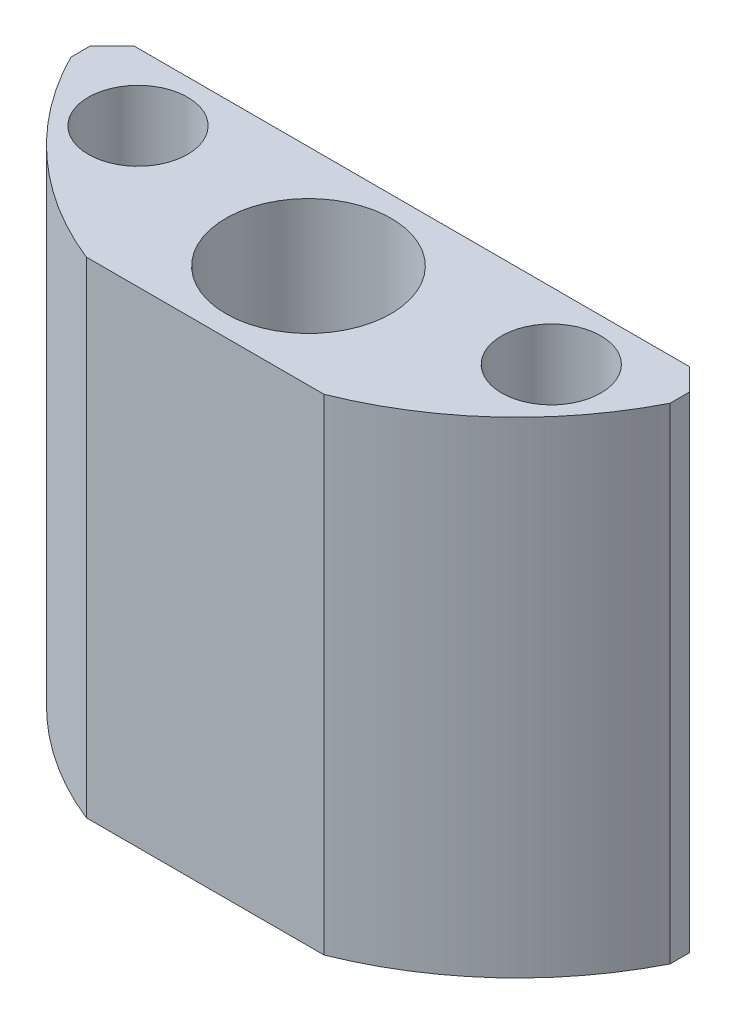
ISO-10303-21;
HEADER;
FILE_DESCRIPTION(('STEP AP214'),'2;1');
FILE_NAME('part.step','',(''),(''),'','','');
FILE_SCHEMA(('AUTOMOTIVE_DESIGN { 1 0 10303 214 1 1 1 1 }'));
ENDSEC;
DATA;
#1=APPLICATION_CONTEXT('core data for automotive mechanical design processes');
#2=APPLICATION_PROTOCOL_DEFINITION('international standard','automotive_design',2000,#1);
#3=PRODUCT_CONTEXT('',#1,'mechanical');
#4=PRODUCT('Part','Part','',(#3));
#5=PRODUCT_RELATED_PRODUCT_CATEGORY('part','',(#4));
#6=PRODUCT_DEFINITION_FORMATION('','',#4);
#7=PRODUCT_DEFINITION_CONTEXT('part definition',#1,'design');
#8=PRODUCT_DEFINITION('design','',#6,#7);
#9=PRODUCT_DEFINITION_SHAPE('','',#8);
#10=(LENGTH_UNIT() NAMED_UNIT(*) SI_UNIT(.MILLI.,.METRE.));
#11=(NAMED_UNIT(*) PLANE_ANGLE_UNIT() SI_UNIT($,.RADIAN.));
#12=(NAMED_UNIT(*) SI_UNIT($,.STERADIAN.) SOLID_ANGLE_UNIT());
#13=UNCERTAINTY_MEASURE_WITH_UNIT(LENGTH_MEASURE(1.E-05),#10,'distance_accuracy_value','');
#14=(GEOMETRIC_REPRESENTATION_CONTEXT(3) GLOBAL_UNCERTAINTY_ASSIGNED_CONTEXT((#13)) GLOBAL_UNIT_ASSIGNED_CONTEXT((#10,
#11,#12)) REPRESENTATION_CONTEXT('',''));
#15=CARTESIAN_POINT('',(0.,0.,0.));
#16=DIRECTION('',(0.,0.,1.));
#17=DIRECTION('',(1.,0.,0.));
#18=AXIS2_PLACEMENT_3D('',#15,#16,#17);
#19=CARTESIAN_POINT('',(20.,-47.,6.5));
#20=DIRECTION('',(0.,1.,0.));
#21=DIRECTION('',(0.,0.,1.));
#22=AXIS2_PLACEMENT_3D('',#19,#20,#21);
#23=CYLINDRICAL_SURFACE('',#22,4.);
#24=CARTESIAN_POINT('',(20.,-47.,6.5));
#25=DIRECTION('',(0.,1.,0.));
#26=DIRECTION('',(0.,0.,1.));
#27=AXIS2_PLACEMENT_3D('',#24,#25,#26);
#28=CIRCLE('',#27,4.);
#29=CARTESIAN_POINT('',(20.,-47.,10.5));
#30=VERTEX_POINT('',#29);
#31=EDGE_CURVE('E170',#30,#30,#28,.T.);
#32=ORIENTED_EDGE('',*,*,#31,.F.);
#33=EDGE_LOOP('',(#32));
#34=FACE_BOUND('',#33,.T.);
#35=CARTESIAN_POINT('',(20.,-37.5,6.5));
#36=DIRECTION('',(0.,1.,0.));
#37=DIRECTION('',(0.,0.,1.));
#38=AXIS2_PLACEMENT_3D('',#35,#36,#37);
#39=CIRCLE('',#38,4.);
#40=CARTESIAN_POINT('',(20.,-37.5,10.5));
#41=VERTEX_POINT('',#40);
#42=EDGE_CURVE('E38',#41,#41,#39,.F.);
#43=ORIENTED_EDGE('',*,*,#42,.F.);
#44=EDGE_LOOP('',(#43));
#45=FACE_BOUND('',#44,.T.);
#46=ADVANCED_FACE('F34',(#34,#45),#23,.F.);
#47=CARTESIAN_POINT('',(-20.,-47.,6.5));
#48=DIRECTION('',(0.,1.,0.));
#49=DIRECTION('',(0.,0.,1.));
#50=AXIS2_PLACEMENT_3D('',#47,#48,#49);
#51=CYLINDRICAL_SURFACE('',#50,4.);
#52=CARTESIAN_POINT('',(-20.,-47.,6.5));
#53=DIRECTION('',(0.,1.,0.));
#54=DIRECTION('',(0.,0.,1.));
#55=AXIS2_PLACEMENT_3D('',#52,#53,#54);
#56=CIRCLE('',#55,4.);
#57=CARTESIAN_POINT('',(-20.,-47.,10.5));
#58=VERTEX_POINT('',#57);
#59=EDGE_CURVE('E137',#58,#58,#56,.T.);
#60=ORIENTED_EDGE('',*,*,#59,.F.);
#61=EDGE_LOOP('',(#60));
#62=FACE_BOUND('',#61,.T.);
#63=CARTESIAN_POINT('',(-20.,-37.5,6.5));
#64=DIRECTION('',(0.,1.,0.));
#65=DIRECTION('',(0.,0.,1.));
#66=AXIS2_PLACEMENT_3D('',#63,#64,#65);
#67=CIRCLE('',#66,4.);
#68=CARTESIAN_POINT('',(-20.,-37.5,10.5));
#69=VERTEX_POINT('',#68);
#70=EDGE_CURVE('E164',#69,#69,#67,.F.);
#71=ORIENTED_EDGE('',*,*,#70,.F.);
#72=EDGE_LOOP('',(#71));
#73=FACE_BOUND('',#72,.T.);
#74=ADVANCED_FACE('F221',(#62,#73),#51,.F.);
#75=CARTESIAN_POINT('',(-26.8786796564404,-47.,0.));
#76=DIRECTION('',(-0.707106781186551,0.,-0.707106781186544));
#77=DIRECTION('',(-0.707106781186544,0.,0.707106781186551));
#78=AXIS2_PLACEMENT_3D('',#75,#76,#77);
#79=PLANE('',#78);
#80=DIRECTION('',(-0.707106781186544,0.,0.707106781186551));
#81=VECTOR('',#80,1.);
#82=CARTESIAN_POINT('',(-26.8786796564404,0.,0.));
#83=LINE('',#82,#81);
#84=CARTESIAN_POINT('',(-26.8786796564404,0.,0.));
#85=VERTEX_POINT('',#84);
#86=CARTESIAN_POINT('',(-29.,0.,2.12132034355965));
#87=VERTEX_POINT('',#86);
#88=EDGE_CURVE('E133',#85,#87,#83,.T.);
#89=ORIENTED_EDGE('',*,*,#88,.F.);
#90=DIRECTION('',(0.,1.,0.));
#91=VECTOR('',#90,1.);
#92=CARTESIAN_POINT('',(-26.8786796564404,-47.,0.));
#93=LINE('',#92,#91);
#94=CARTESIAN_POINT('',(-26.8786796564404,-47.,0.));
#95=VERTEX_POINT('',#94);
#96=EDGE_CURVE('E11',#95,#85,#93,.T.);
#97=ORIENTED_EDGE('',*,*,#96,.F.);
#98=DIRECTION('',(-0.707106781186544,0.,0.707106781186551));
#99=VECTOR('',#98,1.);
#100=CARTESIAN_POINT('',(-26.8786796564404,-47.,0.));
#101=LINE('',#100,#99);
#102=CARTESIAN_POINT('',(-29.,-47.,2.12132034355965));
#103=VERTEX_POINT('',#102);
#104=EDGE_CURVE('E154',#95,#103,#101,.T.);
#105=ORIENTED_EDGE('',*,*,#104,.T.);
#106=DIRECTION('',(0.,1.,0.));
#107=VECTOR('',#106,1.);
#108=CARTESIAN_POINT('',(-29.,-47.,2.12132034355965));
#109=LINE('',#108,#107);
#110=EDGE_CURVE('E91',#103,#87,#109,.T.);
#111=ORIENTED_EDGE('',*,*,#110,.T.);
#112=EDGE_LOOP('',(#89,#97,#105,#111));
#113=FACE_BOUND('',#112,.T.);
#114=ADVANCED_FACE('F36',(#113),#79,.T.);
#115=CARTESIAN_POINT('',(-26.8786796564404,-47.,0.));
#116=DIRECTION('',(0.,0.,-1.));
#117=DIRECTION('',(-1.,0.,0.));
#118=AXIS2_PLACEMENT_3D('',#115,#116,#117);
#119=PLANE('',#118);
#120=DIRECTION('',(-1.,0.,0.));
#121=VECTOR('',#120,1.);
#122=CARTESIAN_POINT('',(-26.8786796564404,0.,0.));
#123=LINE('',#122,#121);
#124=CARTESIAN_POINT('',(26.8786796564404,0.,0.));
#125=VERTEX_POINT('',#124);
#126=EDGE_CURVE('E152',#125,#85,#123,.T.);
#127=ORIENTED_EDGE('',*,*,#126,.F.);
#128=DIRECTION('',(0.,1.,0.));
#129=VECTOR('',#128,1.);
#130=CARTESIAN_POINT('',(26.8786796564404,-47.,0.));
#131=LINE('',#130,#129);
#132=CARTESIAN_POINT('',(26.8786796564404,-47.,0.));
#133=VERTEX_POINT('',#132);
#134=EDGE_CURVE('E44',#133,#125,#131,.T.);
#135=ORIENTED_EDGE('',*,*,#134,.F.);
#136=DIRECTION('',(-1.,0.,0.));
#137=VECTOR('',#136,1.);
#138=CARTESIAN_POINT('',(-26.8786796564404,-47.,0.));
#139=LINE('',#138,#137);
#140=EDGE_CURVE('E123',#133,#95,#139,.T.);
#141=ORIENTED_EDGE('',*,*,#140,.T.);
#142=ORIENTED_EDGE('',*,*,#96,.T.);
#143=EDGE_LOOP('',(#127,#135,#141,#142));
#144=FACE_BOUND('',#143,.T.);
#145=ADVANCED_FACE('F213',(#144),#119,.T.);
#146=CARTESIAN_POINT('',(26.8786796564404,-47.,0.));
#147=DIRECTION('',(0.707106781186551,0.,-0.707106781186544));
#148=DIRECTION('',(-0.707106781186544,0.,-0.707106781186551));
#149=AXIS2_PLACEMENT_3D('',#146,#147,#148);
#150=PLANE('',#149);
#151=DIRECTION('',(-0.707106781186544,0.,-0.707106781186551));
#152=VECTOR('',#151,1.);
#153=CARTESIAN_POINT('',(26.8786796564404,0.,0.));
#154=LINE('',#153,#152);
#155=CARTESIAN_POINT('',(29.,0.,2.12132034355965));
#156=VERTEX_POINT('',#155);
#157=EDGE_CURVE('E110',#156,#125,#154,.T.);
#158=ORIENTED_EDGE('',*,*,#157,.F.);
#159=DIRECTION('',(0.,1.,0.));
#160=VECTOR('',#159,1.);
#161=CARTESIAN_POINT('',(29.,-47.,2.12132034355965));
#162=LINE('',#161,#160);
#163=CARTESIAN_POINT('',(29.,-47.,2.12132034355965));
#164=VERTEX_POINT('',#163);
#165=EDGE_CURVE('E105',#164,#156,#162,.T.);
#166=ORIENTED_EDGE('',*,*,#165,.F.);
#167=DIRECTION('',(-0.707106781186544,0.,-0.707106781186551));
#168=VECTOR('',#167,1.);
#169=CARTESIAN_POINT('',(26.8786796564404,-47.,0.));
#170=LINE('',#169,#168);
#171=EDGE_CURVE('E108',#164,#133,#170,.T.);
#172=ORIENTED_EDGE('',*,*,#171,.T.);
#173=ORIENTED_EDGE('',*,*,#134,.T.);
#174=EDGE_LOOP('',(#158,#166,#172,#173));
#175=FACE_BOUND('',#174,.T.);
#176=ADVANCED_FACE('F107',(#175),#150,.T.);
#177=CARTESIAN_POINT('',(29.,-47.,2.12132034355965));
#178=DIRECTION('',(1.,0.,0.));
#179=DIRECTION('',(0.,0.,-1.));
#180=AXIS2_PLACEMENT_3D('',#177,#178,#179);
#181=PLANE('',#180);
#182=DIRECTION('',(0.,0.,-1.));
#183=VECTOR('',#182,1.);
#184=CARTESIAN_POINT('',(29.,0.,2.12132034355965));
#185=LINE('',#184,#183);
#186=CARTESIAN_POINT('',(29.,0.,4.));
#187=VERTEX_POINT('',#186);
#188=EDGE_CURVE('E149',#187,#156,#185,.T.);
#189=ORIENTED_EDGE('',*,*,#188,.F.);
#190=DIRECTION('',(0.,1.,0.));
#191=VECTOR('',#190,1.);
#192=CARTESIAN_POINT('',(29.,-47.,4.));
#193=LINE('',#192,#191);
#194=CARTESIAN_POINT('',(29.,-47.,4.));
#195=VERTEX_POINT('',#194);
#196=EDGE_CURVE('E115',#195,#187,#193,.T.);
#197=ORIENTED_EDGE('',*,*,#196,.F.);
#198=DIRECTION('',(0.,0.,-1.));
#199=VECTOR('',#198,1.);
#200=CARTESIAN_POINT('',(29.,-47.,2.12132034355965));
#201=LINE('',#200,#199);
#202=EDGE_CURVE('E121',#195,#164,#201,.T.);
#203=ORIENTED_EDGE('',*,*,#202,.T.);
#204=ORIENTED_EDGE('',*,*,#165,.T.);
#205=EDGE_LOOP('',(#189,#197,#203,#204));
#206=FACE_BOUND('',#205,.T.);
#207=ADVANCED_FACE('F125',(#206),#181,.T.);
#208=CARTESIAN_POINT('',(-0.891796155637472,-47.,-11.1238395452285));
#209=DIRECTION('',(0.,1.,0.));
#210=DIRECTION('',(0.,0.,1.));
#211=AXIS2_PLACEMENT_3D('',#208,#209,#210);
#212=CYLINDRICAL_SURFACE('',#211,33.5);
#213=CARTESIAN_POINT('',(-0.891796155637472,0.,-11.1238395452285));
#214=DIRECTION('',(0.,1.,0.));
#215=DIRECTION('',(0.,0.,-1.));
#216=AXIS2_PLACEMENT_3D('',#213,#214,#215);
#217=CIRCLE('',#216,33.5);
#218=CARTESIAN_POINT('',(11.5,0.,20.));
#219=VERTEX_POINT('',#218);
#220=EDGE_CURVE('E146',#219,#187,#217,.T.);
#221=ORIENTED_EDGE('',*,*,#220,.F.);
#222=DIRECTION('',(0.,1.,0.));
#223=VECTOR('',#222,1.);
#224=CARTESIAN_POINT('',(11.5,-47.,20.));
#225=LINE('',#224,#223);
#226=CARTESIAN_POINT('',(11.5,-47.,20.));
#227=VERTEX_POINT('',#226);
#228=EDGE_CURVE('E158',#227,#219,#225,.T.);
#229=ORIENTED_EDGE('',*,*,#228,.F.);
#230=CARTESIAN_POINT('',(-0.891796155637472,-47.,-11.1238395452285));
#231=DIRECTION('',(0.,1.,0.));
#232=DIRECTION('',(0.,0.,-1.));
#233=AXIS2_PLACEMENT_3D('',#230,#231,#232);
#234=CIRCLE('',#233,33.5);
#235=EDGE_CURVE('E126',#227,#195,#234,.T.);
#236=ORIENTED_EDGE('',*,*,#235,.T.);
#237=ORIENTED_EDGE('',*,*,#196,.T.);
#238=EDGE_LOOP('',(#221,#229,#236,#237));
#239=FACE_BOUND('',#238,.T.);
#240=ADVANCED_FACE('F334',(#239),#212,.T.);
#241=CARTESIAN_POINT('',(11.5,-47.,20.));
#242=DIRECTION('',(0.,0.,1.));
#243=DIRECTION('',(1.,0.,0.));
#244=AXIS2_PLACEMENT_3D('',#241,#242,#243);
#245=PLANE('',#244);
#246=DIRECTION('',(1.,0.,0.));
#247=VECTOR('',#246,1.);
#248=CARTESIAN_POINT('',(11.5,0.,20.));
#249=LINE('',#248,#247);
#250=CARTESIAN_POINT('',(-11.5,0.,20.));
#251=VERTEX_POINT('',#250);
#252=EDGE_CURVE('E143',#251,#219,#249,.T.);
#253=ORIENTED_EDGE('',*,*,#252,.F.);
#254=DIRECTION('',(0.,1.,0.));
#255=VECTOR('',#254,1.);
#256=CARTESIAN_POINT('',(-11.5,-47.,20.));
#257=LINE('',#256,#255);
#258=CARTESIAN_POINT('',(-11.5,-47.,20.));
#259=VERTEX_POINT('',#258);
#260=EDGE_CURVE('E160',#259,#251,#257,.T.);
#261=ORIENTED_EDGE('',*,*,#260,.F.);
#262=DIRECTION('',(1.,0.,0.));
#263=VECTOR('',#262,1.);
#264=CARTESIAN_POINT('',(11.5,-47.,20.));
#265=LINE('',#264,#263);
#266=EDGE_CURVE('E128',#259,#227,#265,.T.);
#267=ORIENTED_EDGE('',*,*,#266,.T.);
#268=ORIENTED_EDGE('',*,*,#228,.T.);
#269=EDGE_LOOP('',(#253,#261,#267,#268));
#270=FACE_BOUND('',#269,.T.);
#271=ADVANCED_FACE('F204',(#270),#245,.T.);
#272=CARTESIAN_POINT('',(0.891796155637472,-47.,-11.1238395452285));
#273=DIRECTION('',(0.,1.,0.));
#274=DIRECTION('',(0.,0.,1.));
#275=AXIS2_PLACEMENT_3D('',#272,#273,#274);
#276=CYLINDRICAL_SURFACE('',#275,33.5);
#277=CARTESIAN_POINT('',(0.891796155637472,0.,-11.1238395452285));
#278=DIRECTION('',(0.,1.,0.));
#279=DIRECTION('',(0.,0.,1.));
#280=AXIS2_PLACEMENT_3D('',#277,#278,#279);
#281=CIRCLE('',#280,33.5);
#282=CARTESIAN_POINT('',(-29.,0.,3.99999999999999));
#283=VERTEX_POINT('',#282);
#284=EDGE_CURVE('E140',#283,#251,#281,.T.);
#285=ORIENTED_EDGE('',*,*,#284,.F.);
#286=DIRECTION('',(0.,1.,0.));
#287=VECTOR('',#286,1.);
#288=CARTESIAN_POINT('',(-29.,-47.,3.99999999999999));
#289=LINE('',#288,#287);
#290=CARTESIAN_POINT('',(-29.,-47.,3.99999999999999));
#291=VERTEX_POINT('',#290);
#292=EDGE_CURVE('E162',#291,#283,#289,.T.);
#293=ORIENTED_EDGE('',*,*,#292,.F.);
#294=CARTESIAN_POINT('',(0.891796155637472,-47.,-11.1238395452285));
#295=DIRECTION('',(0.,1.,0.));
#296=DIRECTION('',(0.,0.,1.));
#297=AXIS2_PLACEMENT_3D('',#294,#295,#296);
#298=CIRCLE('',#297,33.5);
#299=EDGE_CURVE('E198',#291,#259,#298,.T.);
#300=ORIENTED_EDGE('',*,*,#299,.T.);
#301=ORIENTED_EDGE('',*,*,#260,.T.);
#302=EDGE_LOOP('',(#285,#293,#300,#301));
#303=FACE_BOUND('',#302,.T.);
#304=ADVANCED_FACE('F209',(#303),#276,.T.);
#305=CARTESIAN_POINT('',(-29.,-47.,2.12132034355965));
#306=DIRECTION('',(-1.,0.,0.));
#307=DIRECTION('',(0.,0.,1.));
#308=AXIS2_PLACEMENT_3D('',#305,#306,#307);
#309=PLANE('',#308);
#310=DIRECTION('',(0.,0.,1.));
#311=VECTOR('',#310,1.);
#312=CARTESIAN_POINT('',(-29.,0.,2.12132034355965));
#313=LINE('',#312,#311);
#314=EDGE_CURVE('E136',#87,#283,#313,.T.);
#315=ORIENTED_EDGE('',*,*,#314,.F.);
#316=ORIENTED_EDGE('',*,*,#110,.F.);
#317=DIRECTION('',(0.,0.,1.));
#318=VECTOR('',#317,1.);
#319=CARTESIAN_POINT('',(-29.,-47.,2.12132034355965));
#320=LINE('',#319,#318);
#321=EDGE_CURVE('E196',#103,#291,#320,.T.);
#322=ORIENTED_EDGE('',*,*,#321,.T.);
#323=ORIENTED_EDGE('',*,*,#292,.T.);
#324=EDGE_LOOP('',(#315,#316,#322,#323));
#325=FACE_BOUND('',#324,.T.);
#326=ADVANCED_FACE('F210',(#325),#309,.T.);
#327=CARTESIAN_POINT('',(0.891796155637472,-47.,-11.1238395452285));
#328=DIRECTION('',(0.,1.,0.));
#329=DIRECTION('',(0.,0.,1.));
#330=AXIS2_PLACEMENT_3D('',#327,#328,#329);
#331=PLANE('',#330);
#332=ORIENTED_EDGE('',*,*,#59,.T.);
#333=EDGE_LOOP('',(#332));
#334=FACE_BOUND('',#333,.T.);
#335=CARTESIAN_POINT('',(0.,-47.,10.));
#336=DIRECTION('',(0.,1.,0.));
#337=DIRECTION('',(0.,0.,1.));
#338=AXIS2_PLACEMENT_3D('',#335,#336,#337);
#339=CIRCLE('',#338,8.);
#340=CARTESIAN_POINT('',(0.,-47.,18.));
#341=VERTEX_POINT('',#340);
#342=EDGE_CURVE('E187',#341,#341,#339,.T.);
#343=ORIENTED_EDGE('',*,*,#342,.T.);
#344=EDGE_LOOP('',(#343));
#345=FACE_BOUND('',#344,.T.);
#346=ORIENTED_EDGE('',*,*,#31,.T.);
#347=EDGE_LOOP('',(#346));
#348=FACE_BOUND('',#347,.T.);
#349=ORIENTED_EDGE('',*,*,#104,.F.);
#350=ORIENTED_EDGE('',*,*,#140,.F.);
#351=ORIENTED_EDGE('',*,*,#171,.F.);
#352=ORIENTED_EDGE('',*,*,#202,.F.);
#353=ORIENTED_EDGE('',*,*,#235,.F.);
#354=ORIENTED_EDGE('',*,*,#266,.F.);
#355=ORIENTED_EDGE('',*,*,#299,.F.);
#356=ORIENTED_EDGE('',*,*,#321,.F.);
#357=EDGE_LOOP('',(#349,#350,#351,#352,#353,#354,#355,#356));
#358=FACE_BOUND('',#357,.T.);
#359=ADVANCED_FACE('F119',(#334,#345,#348,#358),#331,.F.);
#360=CARTESIAN_POINT('',(0.891796155637472,0.,-11.1238395452285));
#361=DIRECTION('',(0.,1.,0.));
#362=DIRECTION('',(0.,0.,1.));
#363=AXIS2_PLACEMENT_3D('',#360,#361,#362);
#364=PLANE('',#363);
#365=CARTESIAN_POINT('',(-20.,0.,6.5));
#366=DIRECTION('',(0.,1.,0.));
#367=DIRECTION('',(0.,0.,1.));
#368=AXIS2_PLACEMENT_3D('',#365,#366,#367);
#369=CIRCLE('',#368,4.8);
#370=CARTESIAN_POINT('',(-20.,0.,11.3));
#371=VERTEX_POINT('',#370);
#372=EDGE_CURVE('E172',#371,#371,#369,.T.);
#373=ORIENTED_EDGE('',*,*,#372,.F.);
#374=EDGE_LOOP('',(#373));
#375=FACE_BOUND('',#374,.T.);
#376=CARTESIAN_POINT('',(20.,0.,6.5));
#377=DIRECTION('',(0.,1.,0.));
#378=DIRECTION('',(0.,0.,1.));
#379=AXIS2_PLACEMENT_3D('',#376,#377,#378);
#380=CIRCLE('',#379,4.8);
#381=CARTESIAN_POINT('',(20.,0.,11.3));
#382=VERTEX_POINT('',#381);
#383=EDGE_CURVE('E182',#382,#382,#380,.T.);
#384=ORIENTED_EDGE('',*,*,#383,.F.);
#385=EDGE_LOOP('',(#384));
#386=FACE_BOUND('',#385,.T.);
#387=CARTESIAN_POINT('',(0.,0.,10.));
#388=DIRECTION('',(0.,1.,0.));
#389=DIRECTION('',(0.,0.,1.));
#390=AXIS2_PLACEMENT_3D('',#387,#388,#389);
#391=CIRCLE('',#390,8.);
#392=CARTESIAN_POINT('',(0.,0.,18.));
#393=VERTEX_POINT('',#392);
#394=EDGE_CURVE('E190',#393,#393,#391,.T.);
#395=ORIENTED_EDGE('',*,*,#394,.F.);
#396=EDGE_LOOP('',(#395));
#397=FACE_BOUND('',#396,.T.);
#398=ORIENTED_EDGE('',*,*,#88,.T.);
#399=ORIENTED_EDGE('',*,*,#314,.T.);
#400=ORIENTED_EDGE('',*,*,#284,.T.);
#401=ORIENTED_EDGE('',*,*,#252,.T.);
#402=ORIENTED_EDGE('',*,*,#220,.T.);
#403=ORIENTED_EDGE('',*,*,#188,.T.);
#404=ORIENTED_EDGE('',*,*,#157,.T.);
#405=ORIENTED_EDGE('',*,*,#126,.T.);
#406=EDGE_LOOP('',(#398,#399,#400,#401,#402,#403,#404,#405));
#407=FACE_BOUND('',#406,.T.);
#408=ADVANCED_FACE('F212',(#375,#386,#397,#407),#364,.T.);
#409=CARTESIAN_POINT('',(0.,-47.,10.));
#410=DIRECTION('',(0.,1.,0.));
#411=DIRECTION('',(0.,0.,1.));
#412=AXIS2_PLACEMENT_3D('',#409,#410,#411);
#413=CYLINDRICAL_SURFACE('',#412,8.);
#414=ORIENTED_EDGE('',*,*,#342,.F.);
#415=EDGE_LOOP('',(#414));
#416=FACE_BOUND('',#415,.T.);
#417=ORIENTED_EDGE('',*,*,#394,.T.);
#418=EDGE_LOOP('',(#417));
#419=FACE_BOUND('',#418,.T.);
#420=ADVANCED_FACE('F235',(#416,#419),#413,.F.);
#421=CARTESIAN_POINT('',(-20.,-37.5,6.5));
#422=DIRECTION('',(0.,1.,0.));
#423=DIRECTION('',(0.,0.,1.));
#424=AXIS2_PLACEMENT_3D('',#421,#422,#423);
#425=PLANE('',#424);
#426=CARTESIAN_POINT('',(-20.,-37.5,6.5));
#427=DIRECTION('',(0.,1.,0.));
#428=DIRECTION('',(0.,0.,1.));
#429=AXIS2_PLACEMENT_3D('',#426,#427,#428);
#430=CIRCLE('',#429,4.8);
#431=CARTESIAN_POINT('',(-20.,-37.5,11.3));
#432=VERTEX_POINT('',#431);
#433=EDGE_CURVE('E166',#432,#432,#430,.T.);
#434=ORIENTED_EDGE('',*,*,#433,.T.);
#435=EDGE_LOOP('',(#434));
#436=FACE_BOUND('',#435,.T.);
#437=ORIENTED_EDGE('',*,*,#70,.T.);
#438=EDGE_LOOP('',(#437));
#439=FACE_BOUND('',#438,.T.);
#440=ADVANCED_FACE('F243',(#436,#439),#425,.T.);
#441=CARTESIAN_POINT('',(-20.,-37.5,6.5));
#442=DIRECTION('',(0.,1.,0.));
#443=DIRECTION('',(0.,0.,1.));
#444=AXIS2_PLACEMENT_3D('',#441,#442,#443);
#445=CYLINDRICAL_SURFACE('',#444,4.8);
#446=ORIENTED_EDGE('',*,*,#433,.F.);
#447=EDGE_LOOP('',(#446));
#448=FACE_BOUND('',#447,.T.);
#449=ORIENTED_EDGE('',*,*,#372,.T.);
#450=EDGE_LOOP('',(#449));
#451=FACE_BOUND('',#450,.T.);
#452=ADVANCED_FACE('F260',(#448,#451),#445,.F.);
#453=CARTESIAN_POINT('',(20.,-37.5,6.5));
#454=DIRECTION('',(0.,1.,0.));
#455=DIRECTION('',(0.,0.,1.));
#456=AXIS2_PLACEMENT_3D('',#453,#454,#455);
#457=PLANE('',#456);
#458=CARTESIAN_POINT('',(20.,-37.5,6.5));
#459=DIRECTION('',(0.,1.,0.));
#460=DIRECTION('',(0.,0.,1.));
#461=AXIS2_PLACEMENT_3D('',#458,#459,#460);
#462=CIRCLE('',#461,4.8);
#463=CARTESIAN_POINT('',(20.,-37.5,11.3));
#464=VERTEX_POINT('',#463);
#465=EDGE_CURVE('E177',#464,#464,#462,.T.);
#466=ORIENTED_EDGE('',*,*,#465,.T.);
#467=EDGE_LOOP('',(#466));
#468=FACE_BOUND('',#467,.T.);
#469=ORIENTED_EDGE('',*,*,#42,.T.);
#470=EDGE_LOOP('',(#469));
#471=FACE_BOUND('',#470,.T.);
#472=ADVANCED_FACE('F254',(#468,#471),#457,.T.);
#473=CARTESIAN_POINT('',(20.,-37.5,6.5));
#474=DIRECTION('',(0.,1.,0.));
#475=DIRECTION('',(0.,0.,1.));
#476=AXIS2_PLACEMENT_3D('',#473,#474,#475);
#477=CYLINDRICAL_SURFACE('',#476,4.8);
#478=ORIENTED_EDGE('',*,*,#465,.F.);
#479=EDGE_LOOP('',(#478));
#480=FACE_BOUND('',#479,.T.);
#481=ORIENTED_EDGE('',*,*,#383,.T.);
#482=EDGE_LOOP('',(#481));
#483=FACE_BOUND('',#482,.T.);
#484=ADVANCED_FACE('F252',(#480,#483),#477,.F.);
#485=CLOSED_SHELL('',(#46,#74,#114,#145,#176,#207,#240,#271,#304,#326,#359,#408,#420,#440,#452,
#472,#484));
#486=MANIFOLD_SOLID_BREP('B2',#485);
#487=ADVANCED_BREP_SHAPE_REPRESENTATION('',(#18,#486),#14);
#488=SHAPE_DEFINITION_REPRESENTATION(#9,#487);
ENDSEC;
END-ISO-10303-21;
